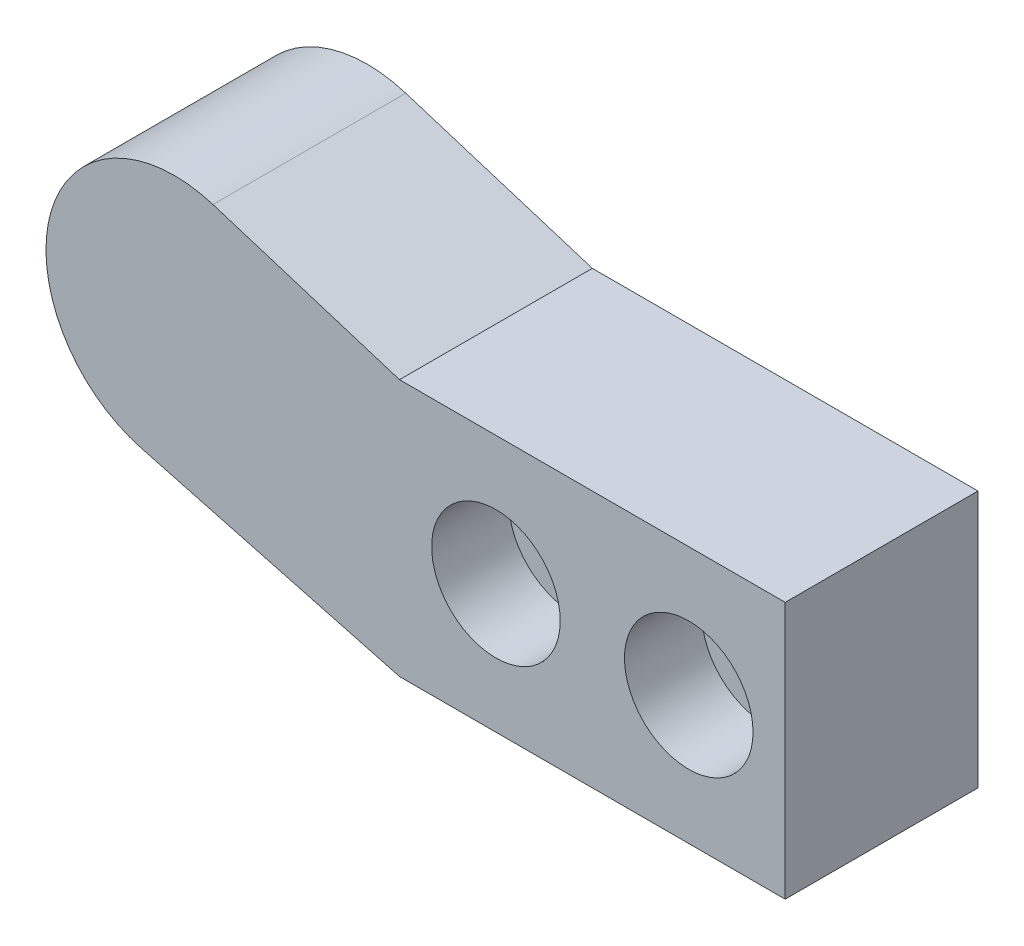
ISO-10303-21;
HEADER;
FILE_DESCRIPTION(('STEP AP214'),'2;1');
FILE_NAME('part.step','',(''),(''),'','','');
FILE_SCHEMA(('AUTOMOTIVE_DESIGN { 1 0 10303 214 1 1 1 1 }'));
ENDSEC;
DATA;
#1=APPLICATION_CONTEXT('core data for automotive mechanical design processes');
#2=APPLICATION_PROTOCOL_DEFINITION('international standard','automotive_design',2000,#1);
#3=PRODUCT_CONTEXT('',#1,'mechanical');
#4=PRODUCT('Part','Part','',(#3));
#5=PRODUCT_RELATED_PRODUCT_CATEGORY('part','',(#4));
#6=PRODUCT_DEFINITION_FORMATION('','',#4);
#7=PRODUCT_DEFINITION_CONTEXT('part definition',#1,'design');
#8=PRODUCT_DEFINITION('design','',#6,#7);
#9=PRODUCT_DEFINITION_SHAPE('','',#8);
#10=(LENGTH_UNIT() NAMED_UNIT(*) SI_UNIT(.MILLI.,.METRE.));
#11=(NAMED_UNIT(*) PLANE_ANGLE_UNIT() SI_UNIT($,.RADIAN.));
#12=(NAMED_UNIT(*) SI_UNIT($,.STERADIAN.) SOLID_ANGLE_UNIT());
#13=UNCERTAINTY_MEASURE_WITH_UNIT(LENGTH_MEASURE(1.E-05),#10,'distance_accuracy_value','');
#14=(GEOMETRIC_REPRESENTATION_CONTEXT(3) GLOBAL_UNCERTAINTY_ASSIGNED_CONTEXT((#13)) GLOBAL_UNIT_ASSIGNED_CONTEXT((#10,
#11,#12)) REPRESENTATION_CONTEXT('',''));
#15=CARTESIAN_POINT('',(0.,0.,0.));
#16=DIRECTION('',(0.,0.,1.));
#17=DIRECTION('',(1.,0.,0.));
#18=AXIS2_PLACEMENT_3D('',#15,#16,#17);
#19=CARTESIAN_POINT('',(7.5,-10.,15.));
#20=DIRECTION('',(0.,0.,-1.));
#21=DIRECTION('',(-1.,0.,0.));
#22=AXIS2_PLACEMENT_3D('',#19,#20,#21);
#23=CYLINDRICAL_SURFACE('',#22,3.);
#24=CARTESIAN_POINT('',(7.5,-10.,0.));
#25=DIRECTION('',(0.,0.,1.));
#26=DIRECTION('',(1.,0.,0.));
#27=AXIS2_PLACEMENT_3D('',#24,#25,#26);
#28=CIRCLE('',#27,3.);
#29=CARTESIAN_POINT('',(10.5,-10.,0.));
#30=VERTEX_POINT('',#29);
#31=EDGE_CURVE('E132',#30,#30,#28,.T.);
#32=ORIENTED_EDGE('',*,*,#31,.F.);
#33=EDGE_LOOP('',(#32));
#34=FACE_BOUND('',#33,.T.);
#35=CARTESIAN_POINT('',(7.5,-10.,9.));
#36=DIRECTION('',(0.,0.,1.));
#37=DIRECTION('',(1.,0.,0.));
#38=AXIS2_PLACEMENT_3D('',#35,#36,#37);
#39=CIRCLE('',#38,3.);
#40=CARTESIAN_POINT('',(10.5,-10.,9.));
#41=VERTEX_POINT('',#40);
#42=EDGE_CURVE('E45',#41,#41,#39,.T.);
#43=ORIENTED_EDGE('',*,*,#42,.T.);
#44=EDGE_LOOP('',(#43));
#45=FACE_BOUND('',#44,.T.);
#46=ADVANCED_FACE('F41',(#34,#45),#23,.F.);
#47=CARTESIAN_POINT('',(22.5,-10.,15.));
#48=DIRECTION('',(0.,0.,-1.));
#49=DIRECTION('',(-1.,0.,0.));
#50=AXIS2_PLACEMENT_3D('',#47,#48,#49);
#51=CYLINDRICAL_SURFACE('',#50,3.);
#52=CARTESIAN_POINT('',(22.5,-10.,0.));
#53=DIRECTION('',(0.,0.,1.));
#54=DIRECTION('',(1.,0.,0.));
#55=AXIS2_PLACEMENT_3D('',#52,#53,#54);
#56=CIRCLE('',#55,3.);
#57=CARTESIAN_POINT('',(25.5,-10.,0.));
#58=VERTEX_POINT('',#57);
#59=EDGE_CURVE('E150',#58,#58,#56,.T.);
#60=ORIENTED_EDGE('',*,*,#59,.F.);
#61=EDGE_LOOP('',(#60));
#62=FACE_BOUND('',#61,.T.);
#63=CARTESIAN_POINT('',(22.5,-10.,9.));
#64=DIRECTION('',(0.,0.,1.));
#65=DIRECTION('',(1.,0.,0.));
#66=AXIS2_PLACEMENT_3D('',#63,#64,#65);
#67=CIRCLE('',#66,3.);
#68=CARTESIAN_POINT('',(25.5,-10.,9.));
#69=VERTEX_POINT('',#68);
#70=EDGE_CURVE('E144',#69,#69,#67,.T.);
#71=ORIENTED_EDGE('',*,*,#70,.T.);
#72=EDGE_LOOP('',(#71));
#73=FACE_BOUND('',#72,.T.);
#74=ADVANCED_FACE('F199',(#62,#73),#51,.F.);
#75=CARTESIAN_POINT('',(-17.5,-5.,15.));
#76=DIRECTION('',(0.,0.,1.));
#77=DIRECTION('',(1.,0.,0.));
#78=AXIS2_PLACEMENT_3D('',#75,#76,#77);
#79=PLANE('',#78);
#80=CARTESIAN_POINT('',(7.5,-10.,15.));
#81=DIRECTION('',(0.,0.,1.));
#82=DIRECTION('',(1.,0.,0.));
#83=AXIS2_PLACEMENT_3D('',#80,#81,#82);
#84=CIRCLE('',#83,5.);
#85=CARTESIAN_POINT('',(12.5,-10.,15.));
#86=VERTEX_POINT('',#85);
#87=EDGE_CURVE('E152',#86,#86,#84,.T.);
#88=ORIENTED_EDGE('',*,*,#87,.F.);
#89=EDGE_LOOP('',(#88));
#90=FACE_BOUND('',#89,.T.);
#91=CARTESIAN_POINT('',(22.5,-10.,15.));
#92=DIRECTION('',(0.,0.,1.));
#93=DIRECTION('',(1.,0.,0.));
#94=AXIS2_PLACEMENT_3D('',#91,#92,#93);
#95=CIRCLE('',#94,5.);
#96=CARTESIAN_POINT('',(27.5,-10.,15.));
#97=VERTEX_POINT('',#96);
#98=EDGE_CURVE('E157',#97,#97,#95,.T.);
#99=ORIENTED_EDGE('',*,*,#98,.F.);
#100=EDGE_LOOP('',(#99));
#101=FACE_BOUND('',#100,.T.);
#102=DIRECTION('',(-0.954327126643161,0.298763678101954,0.));
#103=VECTOR('',#102,1.);
#104=CARTESIAN_POINT('',(0.,0.,15.));
#105=LINE('',#104,#103);
#106=CARTESIAN_POINT('',(0.,0.,15.));
#107=VERTEX_POINT('',#106);
#108=CARTESIAN_POINT('',(-14.5123632189805,4.5432712664316,15.));
#109=VERTEX_POINT('',#108);
#110=EDGE_CURVE('E139',#107,#109,#105,.T.);
#111=ORIENTED_EDGE('',*,*,#110,.T.);
#112=CARTESIAN_POINT('',(-17.5,-5.,15.));
#113=DIRECTION('',(0.,0.,1.));
#114=DIRECTION('',(1.,0.,0.));
#115=AXIS2_PLACEMENT_3D('',#112,#113,#114);
#116=CIRCLE('',#115,9.99999999999999);
#117=CARTESIAN_POINT('',(-20.0693815502951,-14.6642784753443,15.));
#118=VERTEX_POINT('',#117);
#119=EDGE_CURVE('E97',#109,#118,#116,.T.);
#120=ORIENTED_EDGE('',*,*,#119,.T.);
#121=DIRECTION('',(0.96642784753443,-0.256938155029511,0.));
#122=VECTOR('',#121,1.);
#123=CARTESIAN_POINT('',(0.,-20.,15.));
#124=LINE('',#123,#122);
#125=CARTESIAN_POINT('',(0.,-20.,15.));
#126=VERTEX_POINT('',#125);
#127=EDGE_CURVE('E110',#118,#126,#124,.T.);
#128=ORIENTED_EDGE('',*,*,#127,.T.);
#129=DIRECTION('',(1.,0.,0.));
#130=VECTOR('',#129,1.);
#131=CARTESIAN_POINT('',(30.,-20.,15.));
#132=LINE('',#131,#130);
#133=CARTESIAN_POINT('',(30.,-20.,15.));
#134=VERTEX_POINT('',#133);
#135=EDGE_CURVE('E104',#126,#134,#132,.T.);
#136=ORIENTED_EDGE('',*,*,#135,.T.);
#137=DIRECTION('',(0.,1.,0.));
#138=VECTOR('',#137,1.);
#139=CARTESIAN_POINT('',(30.,0.,15.));
#140=LINE('',#139,#138);
#141=CARTESIAN_POINT('',(30.,0.,15.));
#142=VERTEX_POINT('',#141);
#143=EDGE_CURVE('E108',#134,#142,#140,.T.);
#144=ORIENTED_EDGE('',*,*,#143,.T.);
#145=DIRECTION('',(-1.,0.,0.));
#146=VECTOR('',#145,1.);
#147=CARTESIAN_POINT('',(0.,0.,15.));
#148=LINE('',#147,#146);
#149=EDGE_CURVE('E60',#142,#107,#148,.T.);
#150=ORIENTED_EDGE('',*,*,#149,.T.);
#151=EDGE_LOOP('',(#111,#120,#128,#136,#144,#150));
#152=FACE_BOUND('',#151,.T.);
#153=ADVANCED_FACE('F106',(#90,#101,#152),#79,.T.);
#154=CARTESIAN_POINT('',(-17.5,-5.,0.));
#155=DIRECTION('',(0.,0.,1.));
#156=DIRECTION('',(1.,0.,0.));
#157=AXIS2_PLACEMENT_3D('',#154,#155,#156);
#158=PLANE('',#157);
#159=CARTESIAN_POINT('',(-17.5,-5.,0.));
#160=DIRECTION('',(0.,0.,-1.));
#161=DIRECTION('',(-1.,0.,0.));
#162=AXIS2_PLACEMENT_3D('',#159,#160,#161);
#163=CIRCLE('',#162,5.);
#164=CARTESIAN_POINT('',(-22.5,-5.,0.));
#165=VERTEX_POINT('',#164);
#166=EDGE_CURVE('E160',#165,#165,#163,.T.);
#167=ORIENTED_EDGE('',*,*,#166,.F.);
#168=EDGE_LOOP('',(#167));
#169=FACE_BOUND('',#168,.T.);
#170=DIRECTION('',(-0.954327126643161,0.298763678101954,0.));
#171=VECTOR('',#170,1.);
#172=CARTESIAN_POINT('',(0.,0.,0.));
#173=LINE('',#172,#171);
#174=CARTESIAN_POINT('',(0.,0.,0.));
#175=VERTEX_POINT('',#174);
#176=CARTESIAN_POINT('',(-14.5123632189805,4.5432712664316,0.));
#177=VERTEX_POINT('',#176);
#178=EDGE_CURVE('E128',#175,#177,#173,.T.);
#179=ORIENTED_EDGE('',*,*,#178,.F.);
#180=DIRECTION('',(-1.,0.,0.));
#181=VECTOR('',#180,1.);
#182=CARTESIAN_POINT('',(0.,0.,0.));
#183=LINE('',#182,#181);
#184=CARTESIAN_POINT('',(30.,0.,0.));
#185=VERTEX_POINT('',#184);
#186=EDGE_CURVE('E89',#185,#175,#183,.T.);
#187=ORIENTED_EDGE('',*,*,#186,.F.);
#188=DIRECTION('',(0.,1.,0.));
#189=VECTOR('',#188,1.);
#190=CARTESIAN_POINT('',(30.,0.,0.));
#191=LINE('',#190,#189);
#192=CARTESIAN_POINT('',(30.,-20.,0.));
#193=VERTEX_POINT('',#192);
#194=EDGE_CURVE('E83',#193,#185,#191,.T.);
#195=ORIENTED_EDGE('',*,*,#194,.F.);
#196=DIRECTION('',(1.,0.,0.));
#197=VECTOR('',#196,1.);
#198=CARTESIAN_POINT('',(30.,-20.,0.));
#199=LINE('',#198,#197);
#200=CARTESIAN_POINT('',(0.,-20.,0.));
#201=VERTEX_POINT('',#200);
#202=EDGE_CURVE('E118',#201,#193,#199,.T.);
#203=ORIENTED_EDGE('',*,*,#202,.F.);
#204=DIRECTION('',(0.96642784753443,-0.256938155029511,0.));
#205=VECTOR('',#204,1.);
#206=CARTESIAN_POINT('',(0.,-20.,0.));
#207=LINE('',#206,#205);
#208=CARTESIAN_POINT('',(-20.0693815502951,-14.6642784753443,0.));
#209=VERTEX_POINT('',#208);
#210=EDGE_CURVE('E134',#209,#201,#207,.T.);
#211=ORIENTED_EDGE('',*,*,#210,.F.);
#212=CARTESIAN_POINT('',(-17.5,-5.,0.));
#213=DIRECTION('',(0.,0.,1.));
#214=DIRECTION('',(1.,0.,0.));
#215=AXIS2_PLACEMENT_3D('',#212,#213,#214);
#216=CIRCLE('',#215,9.99999999999999);
#217=EDGE_CURVE('E131',#177,#209,#216,.T.);
#218=ORIENTED_EDGE('',*,*,#217,.F.);
#219=EDGE_LOOP('',(#179,#187,#195,#203,#211,#218));
#220=FACE_BOUND('',#219,.T.);
#221=ORIENTED_EDGE('',*,*,#31,.T.);
#222=EDGE_LOOP('',(#221));
#223=FACE_BOUND('',#222,.T.);
#224=ORIENTED_EDGE('',*,*,#59,.T.);
#225=EDGE_LOOP('',(#224));
#226=FACE_BOUND('',#225,.T.);
#227=ADVANCED_FACE('F182',(#169,#220,#223,#226),#158,.F.);
#228=CARTESIAN_POINT('',(0.,0.,15.));
#229=DIRECTION('',(-0.298763678101954,-0.954327126643161,0.));
#230=DIRECTION('',(0.954327126643161,-0.298763678101954,0.));
#231=AXIS2_PLACEMENT_3D('',#228,#229,#230);
#232=PLANE('',#231);
#233=ORIENTED_EDGE('',*,*,#178,.T.);
#234=DIRECTION('',(0.,0.,-1.));
#235=VECTOR('',#234,1.);
#236=CARTESIAN_POINT('',(-14.5123632189805,4.5432712664316,15.));
#237=LINE('',#236,#235);
#238=EDGE_CURVE('E11',#109,#177,#237,.T.);
#239=ORIENTED_EDGE('',*,*,#238,.F.);
#240=ORIENTED_EDGE('',*,*,#110,.F.);
#241=DIRECTION('',(0.,0.,-1.));
#242=VECTOR('',#241,1.);
#243=CARTESIAN_POINT('',(0.,0.,15.));
#244=LINE('',#243,#242);
#245=EDGE_CURVE('E124',#107,#175,#244,.T.);
#246=ORIENTED_EDGE('',*,*,#245,.T.);
#247=EDGE_LOOP('',(#233,#239,#240,#246));
#248=FACE_BOUND('',#247,.T.);
#249=ADVANCED_FACE('F43',(#248),#232,.F.);
#250=CARTESIAN_POINT('',(-17.5,-5.,15.));
#251=DIRECTION('',(0.,0.,-1.));
#252=DIRECTION('',(-1.,0.,0.));
#253=AXIS2_PLACEMENT_3D('',#250,#251,#252);
#254=CYLINDRICAL_SURFACE('',#253,9.99999999999999);
#255=ORIENTED_EDGE('',*,*,#217,.T.);
#256=DIRECTION('',(0.,0.,-1.));
#257=VECTOR('',#256,1.);
#258=CARTESIAN_POINT('',(-20.0693815502951,-14.6642784753443,15.));
#259=LINE('',#258,#257);
#260=EDGE_CURVE('E51',#118,#209,#259,.T.);
#261=ORIENTED_EDGE('',*,*,#260,.F.);
#262=ORIENTED_EDGE('',*,*,#119,.F.);
#263=ORIENTED_EDGE('',*,*,#238,.T.);
#264=EDGE_LOOP('',(#255,#261,#262,#263));
#265=FACE_BOUND('',#264,.T.);
#266=ADVANCED_FACE('F176',(#265),#254,.T.);
#267=CARTESIAN_POINT('',(0.,-20.,15.));
#268=DIRECTION('',(0.256938155029511,0.96642784753443,0.));
#269=DIRECTION('',(-0.96642784753443,0.256938155029512,0.));
#270=AXIS2_PLACEMENT_3D('',#267,#268,#269);
#271=PLANE('',#270);
#272=ORIENTED_EDGE('',*,*,#210,.T.);
#273=DIRECTION('',(0.,0.,-1.));
#274=VECTOR('',#273,1.);
#275=CARTESIAN_POINT('',(0.,-20.,15.));
#276=LINE('',#275,#274);
#277=EDGE_CURVE('E119',#126,#201,#276,.T.);
#278=ORIENTED_EDGE('',*,*,#277,.F.);
#279=ORIENTED_EDGE('',*,*,#127,.F.);
#280=ORIENTED_EDGE('',*,*,#260,.T.);
#281=EDGE_LOOP('',(#272,#278,#279,#280));
#282=FACE_BOUND('',#281,.T.);
#283=ADVANCED_FACE('F179',(#282),#271,.F.);
#284=CARTESIAN_POINT('',(30.,-20.,15.));
#285=DIRECTION('',(0.,1.,0.));
#286=DIRECTION('',(0.,0.,1.));
#287=AXIS2_PLACEMENT_3D('',#284,#285,#286);
#288=PLANE('',#287);
#289=ORIENTED_EDGE('',*,*,#202,.T.);
#290=DIRECTION('',(0.,0.,-1.));
#291=VECTOR('',#290,1.);
#292=CARTESIAN_POINT('',(30.,-20.,15.));
#293=LINE('',#292,#291);
#294=EDGE_CURVE('E115',#134,#193,#293,.T.);
#295=ORIENTED_EDGE('',*,*,#294,.F.);
#296=ORIENTED_EDGE('',*,*,#135,.F.);
#297=ORIENTED_EDGE('',*,*,#277,.T.);
#298=EDGE_LOOP('',(#289,#295,#296,#297));
#299=FACE_BOUND('',#298,.T.);
#300=ADVANCED_FACE('F116',(#299),#288,.F.);
#301=CARTESIAN_POINT('',(30.,0.,15.));
#302=DIRECTION('',(-1.,0.,0.));
#303=DIRECTION('',(0.,-1.,0.));
#304=AXIS2_PLACEMENT_3D('',#301,#302,#303);
#305=PLANE('',#304);
#306=ORIENTED_EDGE('',*,*,#194,.T.);
#307=DIRECTION('',(0.,0.,-1.));
#308=VECTOR('',#307,1.);
#309=CARTESIAN_POINT('',(30.,0.,15.));
#310=LINE('',#309,#308);
#311=EDGE_CURVE('E120',#142,#185,#310,.T.);
#312=ORIENTED_EDGE('',*,*,#311,.F.);
#313=ORIENTED_EDGE('',*,*,#143,.F.);
#314=ORIENTED_EDGE('',*,*,#294,.T.);
#315=EDGE_LOOP('',(#306,#312,#313,#314));
#316=FACE_BOUND('',#315,.T.);
#317=ADVANCED_FACE('F122',(#316),#305,.F.);
#318=CARTESIAN_POINT('',(0.,0.,15.));
#319=DIRECTION('',(0.,-1.,0.));
#320=DIRECTION('',(0.,0.,-1.));
#321=AXIS2_PLACEMENT_3D('',#318,#319,#320);
#322=PLANE('',#321);
#323=ORIENTED_EDGE('',*,*,#186,.T.);
#324=ORIENTED_EDGE('',*,*,#245,.F.);
#325=ORIENTED_EDGE('',*,*,#149,.F.);
#326=ORIENTED_EDGE('',*,*,#311,.T.);
#327=EDGE_LOOP('',(#323,#324,#325,#326));
#328=FACE_BOUND('',#327,.T.);
#329=ADVANCED_FACE('F185',(#328),#322,.F.);
#330=CARTESIAN_POINT('',(22.5,-10.,9.));
#331=DIRECTION('',(0.,0.,1.));
#332=DIRECTION('',(1.,0.,0.));
#333=AXIS2_PLACEMENT_3D('',#330,#331,#332);
#334=CYLINDRICAL_SURFACE('',#333,5.);
#335=CARTESIAN_POINT('',(22.5,-10.,9.));
#336=DIRECTION('',(0.,0.,1.));
#337=DIRECTION('',(1.,0.,0.));
#338=AXIS2_PLACEMENT_3D('',#335,#336,#337);
#339=CIRCLE('',#338,5.);
#340=CARTESIAN_POINT('',(27.5,-10.,9.));
#341=VERTEX_POINT('',#340);
#342=EDGE_CURVE('E165',#341,#341,#339,.T.);
#343=ORIENTED_EDGE('',*,*,#342,.F.);
#344=EDGE_LOOP('',(#343));
#345=FACE_BOUND('',#344,.T.);
#346=ORIENTED_EDGE('',*,*,#98,.T.);
#347=EDGE_LOOP('',(#346));
#348=FACE_BOUND('',#347,.T.);
#349=ADVANCED_FACE('F187',(#345,#348),#334,.F.);
#350=CARTESIAN_POINT('',(22.5,-10.,9.));
#351=DIRECTION('',(0.,0.,1.));
#352=DIRECTION('',(1.,0.,0.));
#353=AXIS2_PLACEMENT_3D('',#350,#351,#352);
#354=PLANE('',#353);
#355=ORIENTED_EDGE('',*,*,#70,.F.);
#356=EDGE_LOOP('',(#355));
#357=FACE_BOUND('',#356,.T.);
#358=ORIENTED_EDGE('',*,*,#342,.T.);
#359=EDGE_LOOP('',(#358));
#360=FACE_BOUND('',#359,.T.);
#361=ADVANCED_FACE('F194',(#357,#360),#354,.T.);
#362=CARTESIAN_POINT('',(7.5,-10.,9.));
#363=DIRECTION('',(0.,0.,1.));
#364=DIRECTION('',(1.,0.,0.));
#365=AXIS2_PLACEMENT_3D('',#362,#363,#364);
#366=CYLINDRICAL_SURFACE('',#365,5.);
#367=CARTESIAN_POINT('',(7.5,-10.,9.));
#368=DIRECTION('',(0.,0.,1.));
#369=DIRECTION('',(1.,0.,0.));
#370=AXIS2_PLACEMENT_3D('',#367,#368,#369);
#371=CIRCLE('',#370,5.);
#372=CARTESIAN_POINT('',(12.5,-10.,9.));
#373=VERTEX_POINT('',#372);
#374=EDGE_CURVE('E146',#373,#373,#371,.T.);
#375=ORIENTED_EDGE('',*,*,#374,.F.);
#376=EDGE_LOOP('',(#375));
#377=FACE_BOUND('',#376,.T.);
#378=ORIENTED_EDGE('',*,*,#87,.T.);
#379=EDGE_LOOP('',(#378));
#380=FACE_BOUND('',#379,.T.);
#381=ADVANCED_FACE('F247',(#377,#380),#366,.F.);
#382=CARTESIAN_POINT('',(7.5,-10.,9.));
#383=DIRECTION('',(0.,0.,1.));
#384=DIRECTION('',(1.,0.,0.));
#385=AXIS2_PLACEMENT_3D('',#382,#383,#384);
#386=PLANE('',#385);
#387=ORIENTED_EDGE('',*,*,#42,.F.);
#388=EDGE_LOOP('',(#387));
#389=FACE_BOUND('',#388,.T.);
#390=ORIENTED_EDGE('',*,*,#374,.T.);
#391=EDGE_LOOP('',(#390));
#392=FACE_BOUND('',#391,.T.);
#393=ADVANCED_FACE('F243',(#389,#392),#386,.T.);
#394=CARTESIAN_POINT('',(-17.5,-5.,3.));
#395=DIRECTION('',(0.,0.,-1.));
#396=DIRECTION('',(-1.,0.,0.));
#397=AXIS2_PLACEMENT_3D('',#394,#395,#396);
#398=CYLINDRICAL_SURFACE('',#397,5.);
#399=CARTESIAN_POINT('',(-17.5,-5.,3.));
#400=DIRECTION('',(0.,0.,-1.));
#401=DIRECTION('',(-1.,0.,0.));
#402=AXIS2_PLACEMENT_3D('',#399,#400,#401);
#403=CIRCLE('',#402,5.);
#404=CARTESIAN_POINT('',(-22.5,-5.,3.));
#405=VERTEX_POINT('',#404);
#406=EDGE_CURVE('E168',#405,#405,#403,.T.);
#407=ORIENTED_EDGE('',*,*,#406,.F.);
#408=EDGE_LOOP('',(#407));
#409=FACE_BOUND('',#408,.T.);
#410=ORIENTED_EDGE('',*,*,#166,.T.);
#411=EDGE_LOOP('',(#410));
#412=FACE_BOUND('',#411,.T.);
#413=ADVANCED_FACE('F239',(#409,#412),#398,.F.);
#414=CARTESIAN_POINT('',(-17.5,-5.,3.));
#415=DIRECTION('',(0.,0.,-1.));
#416=DIRECTION('',(-1.,0.,0.));
#417=AXIS2_PLACEMENT_3D('',#414,#415,#416);
#418=PLANE('',#417);
#419=CARTESIAN_POINT('',(-17.5,-5.,3.));
#420=DIRECTION('',(0.,0.,-1.));
#421=DIRECTION('',(-1.,0.,0.));
#422=AXIS2_PLACEMENT_3D('',#419,#420,#421);
#423=CIRCLE('',#422,2.5);
#424=CARTESIAN_POINT('',(-20.,-5.,3.));
#425=VERTEX_POINT('',#424);
#426=EDGE_CURVE('E226',#425,#425,#423,.T.);
#427=ORIENTED_EDGE('',*,*,#426,.F.);
#428=EDGE_LOOP('',(#427));
#429=FACE_BOUND('',#428,.T.);
#430=ORIENTED_EDGE('',*,*,#406,.T.);
#431=EDGE_LOOP('',(#430));
#432=FACE_BOUND('',#431,.T.);
#433=ADVANCED_FACE('F236',(#429,#432),#418,.T.);
#434=CARTESIAN_POINT('',(-17.5,-5.,13.));
#435=DIRECTION('',(0.,0.,-1.));
#436=DIRECTION('',(-1.,0.,0.));
#437=AXIS2_PLACEMENT_3D('',#434,#435,#436);
#438=CYLINDRICAL_SURFACE('',#437,2.5);
#439=CARTESIAN_POINT('',(-17.5,-5.,13.));
#440=DIRECTION('',(0.,0.,-1.));
#441=DIRECTION('',(-1.,0.,0.));
#442=AXIS2_PLACEMENT_3D('',#439,#440,#441);
#443=CIRCLE('',#442,2.5);
#444=CARTESIAN_POINT('',(-20.,-5.,13.));
#445=VERTEX_POINT('',#444);
#446=EDGE_CURVE('E223',#445,#445,#443,.T.);
#447=ORIENTED_EDGE('',*,*,#446,.F.);
#448=EDGE_LOOP('',(#447));
#449=FACE_BOUND('',#448,.T.);
#450=ORIENTED_EDGE('',*,*,#426,.T.);
#451=EDGE_LOOP('',(#450));
#452=FACE_BOUND('',#451,.T.);
#453=ADVANCED_FACE('F234',(#449,#452),#438,.F.);
#454=CARTESIAN_POINT('',(-17.5,-5.,13.));
#455=DIRECTION('',(0.,0.,-1.));
#456=DIRECTION('',(-1.,0.,0.));
#457=AXIS2_PLACEMENT_3D('',#454,#455,#456);
#458=PLANE('',#457);
#459=ORIENTED_EDGE('',*,*,#446,.T.);
#460=EDGE_LOOP('',(#459));
#461=FACE_BOUND('',#460,.T.);
#462=ADVANCED_FACE('F295',(#461),#458,.T.);
#463=CLOSED_SHELL('',(#46,#74,#153,#227,#249,#266,#283,#300,#317,#329,#349,#361,#381,#393,#413,
#433,#453,#462));
#464=MANIFOLD_SOLID_BREP('B2',#463);
#465=ADVANCED_BREP_SHAPE_REPRESENTATION('',(#18,#464),#14);
#466=SHAPE_DEFINITION_REPRESENTATION(#9,#465);
ENDSEC;
END-ISO-10303-21;
